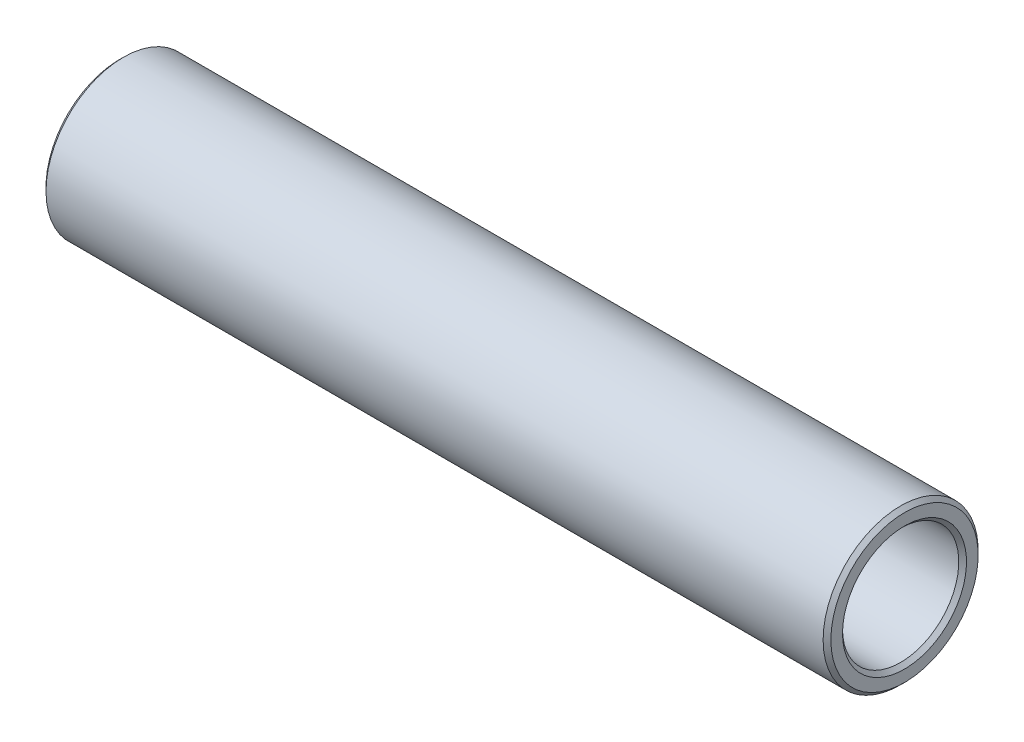
ISO-10303-21;
HEADER;
FILE_DESCRIPTION(('STEP AP214'),'2;1');
FILE_NAME('part.step','',(''),(''),'','','');
FILE_SCHEMA(('AUTOMOTIVE_DESIGN { 1 0 10303 214 1 1 1 1 }'));
ENDSEC;
DATA;
#1=APPLICATION_CONTEXT('core data for automotive mechanical design processes');
#2=APPLICATION_PROTOCOL_DEFINITION('international standard','automotive_design',2000,#1);
#3=PRODUCT_CONTEXT('',#1,'mechanical');
#4=PRODUCT('Part','Part','',(#3));
#5=PRODUCT_RELATED_PRODUCT_CATEGORY('part','',(#4));
#6=PRODUCT_DEFINITION_FORMATION('','',#4);
#7=PRODUCT_DEFINITION_CONTEXT('part definition',#1,'design');
#8=PRODUCT_DEFINITION('design','',#6,#7);
#9=PRODUCT_DEFINITION_SHAPE('','',#8);
#10=(LENGTH_UNIT() NAMED_UNIT(*) SI_UNIT(.MILLI.,.METRE.));
#11=(NAMED_UNIT(*) PLANE_ANGLE_UNIT() SI_UNIT($,.RADIAN.));
#12=(NAMED_UNIT(*) SI_UNIT($,.STERADIAN.) SOLID_ANGLE_UNIT());
#13=UNCERTAINTY_MEASURE_WITH_UNIT(LENGTH_MEASURE(1.E-05),#10,'distance_accuracy_value','');
#14=(GEOMETRIC_REPRESENTATION_CONTEXT(3) GLOBAL_UNCERTAINTY_ASSIGNED_CONTEXT((#13)) GLOBAL_UNIT_ASSIGNED_CONTEXT((#10,
#11,#12)) REPRESENTATION_CONTEXT('',''));
#15=CARTESIAN_POINT('',(0.,0.,0.));
#16=DIRECTION('',(0.,0.,1.));
#17=DIRECTION('',(1.,0.,0.));
#18=AXIS2_PLACEMENT_3D('',#15,#16,#17);
#19=CARTESIAN_POINT('',(0.,3.,0.));
#20=DIRECTION('',(1.,0.,0.));
#21=DIRECTION('',(0.,0.,-1.));
#22=AXIS2_PLACEMENT_3D('',#19,#20,#21);
#23=PLANE('',#22);
#24=CARTESIAN_POINT('',(0.,0.,0.));
#25=DIRECTION('',(1.,0.,0.));
#26=DIRECTION('',(0.,0.,-1.));
#27=AXIS2_PLACEMENT_3D('',#24,#25,#26);
#28=CIRCLE('',#27,3.19999999999999);
#29=CARTESIAN_POINT('',(0.,0.,-3.19999999999999));
#30=VERTEX_POINT('',#29);
#31=EDGE_CURVE('E53',#30,#30,#28,.T.);
#32=ORIENTED_EDGE('',*,*,#31,.T.);
#33=EDGE_LOOP('',(#32));
#34=FACE_BOUND('',#33,.T.);
#35=CARTESIAN_POINT('',(0.,0.,0.));
#36=DIRECTION('',(1.,0.,0.));
#37=DIRECTION('',(0.,0.,-1.));
#38=AXIS2_PLACEMENT_3D('',#35,#36,#37);
#39=CIRCLE('',#38,3.80000000000001);
#40=CARTESIAN_POINT('',(0.,0.,-3.80000000000001));
#41=VERTEX_POINT('',#40);
#42=EDGE_CURVE('E56',#41,#41,#39,.F.);
#43=ORIENTED_EDGE('',*,*,#42,.T.);
#44=EDGE_LOOP('',(#43));
#45=FACE_BOUND('',#44,.T.);
#46=ADVANCED_FACE('F33',(#34,#45),#23,.F.);
#47=CARTESIAN_POINT('',(0.,0.,0.));
#48=DIRECTION('',(-1.,0.,0.));
#49=DIRECTION('',(0.,0.,1.));
#50=AXIS2_PLACEMENT_3D('',#47,#48,#49);
#51=CYLINDRICAL_SURFACE('',#50,4.);
#52=CARTESIAN_POINT('',(0.199999999999992,0.,0.));
#53=DIRECTION('',(1.,0.,0.));
#54=DIRECTION('',(0.,0.,-1.));
#55=AXIS2_PLACEMENT_3D('',#52,#53,#54);
#56=CIRCLE('',#55,4.);
#57=CARTESIAN_POINT('',(0.199999999999992,0.,-4.));
#58=VERTEX_POINT('',#57);
#59=EDGE_CURVE('E44',#58,#58,#56,.T.);
#60=ORIENTED_EDGE('',*,*,#59,.T.);
#61=EDGE_LOOP('',(#60));
#62=FACE_BOUND('',#61,.T.);
#63=CARTESIAN_POINT('',(40.3,0.,0.));
#64=DIRECTION('',(-1.,0.,0.));
#65=DIRECTION('',(0.,0.,1.));
#66=AXIS2_PLACEMENT_3D('',#63,#64,#65);
#67=CIRCLE('',#66,4.);
#68=CARTESIAN_POINT('',(40.3,0.,4.));
#69=VERTEX_POINT('',#68);
#70=EDGE_CURVE('E48',#69,#69,#67,.T.);
#71=ORIENTED_EDGE('',*,*,#70,.T.);
#72=EDGE_LOOP('',(#71));
#73=FACE_BOUND('',#72,.T.);
#74=ADVANCED_FACE('F81',(#62,#73),#51,.T.);
#75=CARTESIAN_POINT('',(40.5,3.,0.));
#76=DIRECTION('',(-1.,0.,0.));
#77=DIRECTION('',(0.,0.,1.));
#78=AXIS2_PLACEMENT_3D('',#75,#76,#77);
#79=PLANE('',#78);
#80=CARTESIAN_POINT('',(40.5,0.,0.));
#81=DIRECTION('',(-1.,0.,0.));
#82=DIRECTION('',(0.,0.,1.));
#83=AXIS2_PLACEMENT_3D('',#80,#81,#82);
#84=CIRCLE('',#83,3.2);
#85=CARTESIAN_POINT('',(40.5,0.,3.2));
#86=VERTEX_POINT('',#85);
#87=EDGE_CURVE('E10',#86,#86,#84,.T.);
#88=ORIENTED_EDGE('',*,*,#87,.T.);
#89=EDGE_LOOP('',(#88));
#90=FACE_BOUND('',#89,.T.);
#91=CARTESIAN_POINT('',(40.5,0.,0.));
#92=DIRECTION('',(-1.,0.,0.));
#93=DIRECTION('',(0.,0.,1.));
#94=AXIS2_PLACEMENT_3D('',#91,#92,#93);
#95=CIRCLE('',#94,3.8);
#96=CARTESIAN_POINT('',(40.5,0.,3.8));
#97=VERTEX_POINT('',#96);
#98=EDGE_CURVE('E40',#97,#97,#95,.F.);
#99=ORIENTED_EDGE('',*,*,#98,.T.);
#100=EDGE_LOOP('',(#99));
#101=FACE_BOUND('',#100,.T.);
#102=ADVANCED_FACE('F87',(#90,#101),#79,.F.);
#103=CARTESIAN_POINT('',(0.,0.,0.));
#104=DIRECTION('',(-1.,0.,0.));
#105=DIRECTION('',(0.,0.,1.));
#106=AXIS2_PLACEMENT_3D('',#103,#104,#105);
#107=CYLINDRICAL_SURFACE('',#106,3.);
#108=CARTESIAN_POINT('',(0.199999999999991,0.,0.));
#109=DIRECTION('',(1.,0.,0.));
#110=DIRECTION('',(0.,0.,-1.));
#111=AXIS2_PLACEMENT_3D('',#108,#109,#110);
#112=CIRCLE('',#111,3.);
#113=CARTESIAN_POINT('',(0.199999999999991,0.,-3.));
#114=VERTEX_POINT('',#113);
#115=EDGE_CURVE('E59',#114,#114,#112,.F.);
#116=ORIENTED_EDGE('',*,*,#115,.T.);
#117=EDGE_LOOP('',(#116));
#118=FACE_BOUND('',#117,.T.);
#119=CARTESIAN_POINT('',(40.3,0.,0.));
#120=DIRECTION('',(-1.,0.,0.));
#121=DIRECTION('',(0.,0.,1.));
#122=AXIS2_PLACEMENT_3D('',#119,#120,#121);
#123=CIRCLE('',#122,3.);
#124=CARTESIAN_POINT('',(40.3,0.,3.));
#125=VERTEX_POINT('',#124);
#126=EDGE_CURVE('E62',#125,#125,#123,.F.);
#127=ORIENTED_EDGE('',*,*,#126,.T.);
#128=EDGE_LOOP('',(#127));
#129=FACE_BOUND('',#128,.T.);
#130=ADVANCED_FACE('F66',(#118,#129),#107,.F.);
#131=CARTESIAN_POINT('',(0.199999999999991,0.,0.));
#132=DIRECTION('',(-1.,0.,0.));
#133=DIRECTION('',(0.,0.,1.));
#134=AXIS2_PLACEMENT_3D('',#131,#132,#133);
#135=CONICAL_SURFACE('',#134,3.,0.785398163397449);
#136=ORIENTED_EDGE('',*,*,#31,.F.);
#137=EDGE_LOOP('',(#136));
#138=FACE_BOUND('',#137,.T.);
#139=ORIENTED_EDGE('',*,*,#115,.F.);
#140=EDGE_LOOP('',(#139));
#141=FACE_BOUND('',#140,.T.);
#142=ADVANCED_FACE('F77',(#138,#141),#135,.F.);
#143=CARTESIAN_POINT('',(0.,0.,0.));
#144=DIRECTION('',(1.,0.,0.));
#145=DIRECTION('',(0.,0.,-1.));
#146=AXIS2_PLACEMENT_3D('',#143,#144,#145);
#147=CONICAL_SURFACE('',#146,3.80000000000001,0.785398163397448);
#148=ORIENTED_EDGE('',*,*,#59,.F.);
#149=EDGE_LOOP('',(#148));
#150=FACE_BOUND('',#149,.T.);
#151=ORIENTED_EDGE('',*,*,#42,.F.);
#152=EDGE_LOOP('',(#151));
#153=FACE_BOUND('',#152,.T.);
#154=ADVANCED_FACE('F71',(#150,#153),#147,.T.);
#155=CARTESIAN_POINT('',(40.5,0.,0.));
#156=DIRECTION('',(1.,0.,0.));
#157=DIRECTION('',(0.,0.,-1.));
#158=AXIS2_PLACEMENT_3D('',#155,#156,#157);
#159=CONICAL_SURFACE('',#158,3.2,0.785398163397446);
#160=ORIENTED_EDGE('',*,*,#126,.F.);
#161=EDGE_LOOP('',(#160));
#162=FACE_BOUND('',#161,.T.);
#163=ORIENTED_EDGE('',*,*,#87,.F.);
#164=EDGE_LOOP('',(#163));
#165=FACE_BOUND('',#164,.T.);
#166=ADVANCED_FACE('F68',(#162,#165),#159,.F.);
#167=CARTESIAN_POINT('',(40.3,0.,0.));
#168=DIRECTION('',(-1.,0.,0.));
#169=DIRECTION('',(0.,0.,1.));
#170=AXIS2_PLACEMENT_3D('',#167,#168,#169);
#171=CONICAL_SURFACE('',#170,4.,0.785398163397422);
#172=ORIENTED_EDGE('',*,*,#98,.F.);
#173=EDGE_LOOP('',(#172));
#174=FACE_BOUND('',#173,.T.);
#175=ORIENTED_EDGE('',*,*,#70,.F.);
#176=EDGE_LOOP('',(#175));
#177=FACE_BOUND('',#176,.T.);
#178=ADVANCED_FACE('F35',(#174,#177),#171,.T.);
#179=CLOSED_SHELL('',(#46,#74,#102,#130,#142,#154,#166,#178));
#180=MANIFOLD_SOLID_BREP('B2',#179);
#181=ADVANCED_BREP_SHAPE_REPRESENTATION('',(#18,#180),#14);
#182=SHAPE_DEFINITION_REPRESENTATION(#9,#181);
ENDSEC;
END-ISO-10303-21;
